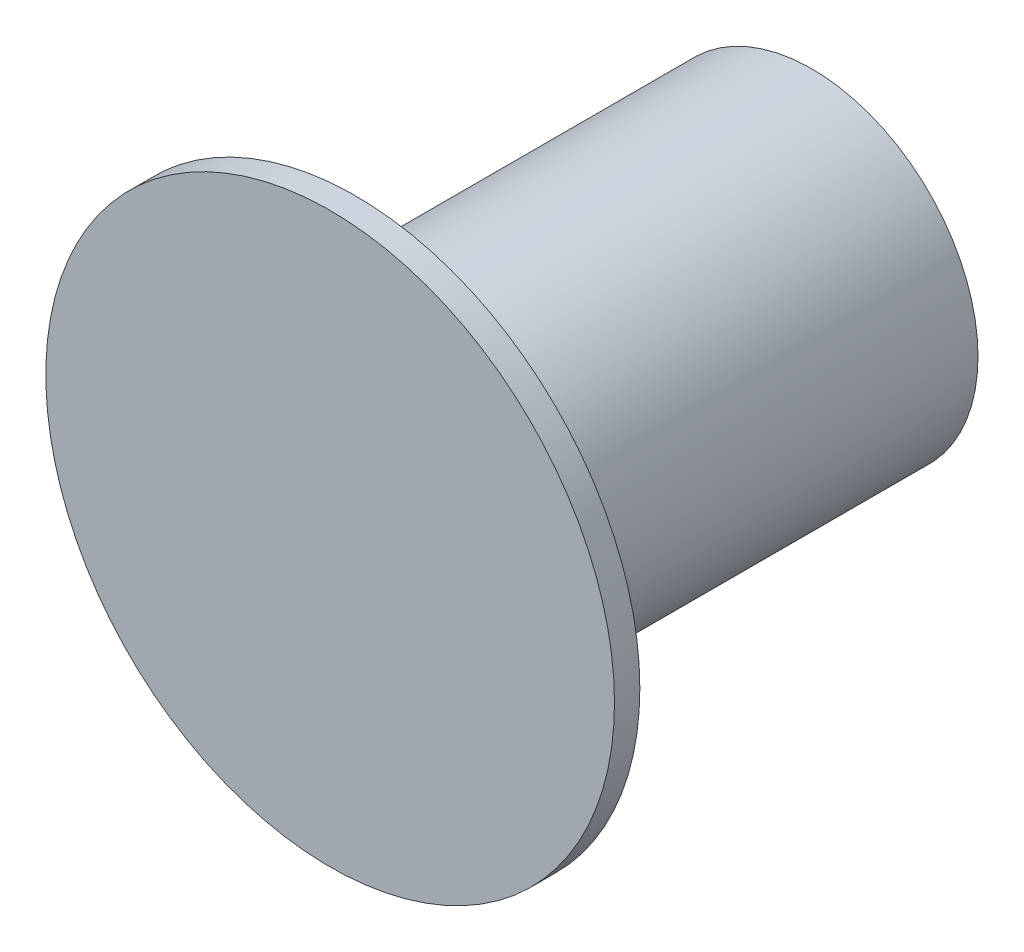
ISO-10303-21;
HEADER;
FILE_DESCRIPTION(('STEP AP214'),'2;1');
FILE_NAME('part.step','',(''),(''),'','','');
FILE_SCHEMA(('AUTOMOTIVE_DESIGN { 1 0 10303 214 1 1 1 1 }'));
ENDSEC;
DATA;
#1=APPLICATION_CONTEXT('core data for automotive mechanical design processes');
#2=APPLICATION_PROTOCOL_DEFINITION('international standard','automotive_design',2000,#1);
#3=PRODUCT_CONTEXT('',#1,'mechanical');
#4=PRODUCT('Part','Part','',(#3));
#5=PRODUCT_RELATED_PRODUCT_CATEGORY('part','',(#4));
#6=PRODUCT_DEFINITION_FORMATION('','',#4);
#7=PRODUCT_DEFINITION_CONTEXT('part definition',#1,'design');
#8=PRODUCT_DEFINITION('design','',#6,#7);
#9=PRODUCT_DEFINITION_SHAPE('','',#8);
#10=(LENGTH_UNIT() NAMED_UNIT(*) SI_UNIT(.MILLI.,.METRE.));
#11=(NAMED_UNIT(*) PLANE_ANGLE_UNIT() SI_UNIT($,.RADIAN.));
#12=(NAMED_UNIT(*) SI_UNIT($,.STERADIAN.) SOLID_ANGLE_UNIT());
#13=UNCERTAINTY_MEASURE_WITH_UNIT(LENGTH_MEASURE(1.E-05),#10,'distance_accuracy_value','');
#14=(GEOMETRIC_REPRESENTATION_CONTEXT(3) GLOBAL_UNCERTAINTY_ASSIGNED_CONTEXT((#13)) GLOBAL_UNIT_ASSIGNED_CONTEXT((#10,
#11,#12)) REPRESENTATION_CONTEXT('',''));
#15=CARTESIAN_POINT('',(0.,0.,0.));
#16=DIRECTION('',(0.,0.,1.));
#17=DIRECTION('',(1.,0.,0.));
#18=AXIS2_PLACEMENT_3D('',#15,#16,#17);
#19=CARTESIAN_POINT('',(-12.3823397391834,-201.48071253208,-28.0000000000053));
#20=DIRECTION('',(0.,0.,1.));
#21=DIRECTION('',(1.,0.,0.));
#22=AXIS2_PLACEMENT_3D('',#19,#20,#21);
#23=CYLINDRICAL_SURFACE('',#22,6.54966241096472);
#24=CARTESIAN_POINT('',(-12.3823397391834,-201.48071253208,-28.0000000000053));
#25=DIRECTION('',(0.,0.,1.));
#26=DIRECTION('',(1.,0.,0.));
#27=AXIS2_PLACEMENT_3D('',#24,#25,#26);
#28=CIRCLE('',#27,6.54966241096472);
#29=CARTESIAN_POINT('',(-5.83267732821872,-201.48071253208,-28.0000000000053));
#30=VERTEX_POINT('',#29);
#31=EDGE_CURVE('E10',#30,#30,#28,.T.);
#32=ORIENTED_EDGE('',*,*,#31,.T.);
#33=EDGE_LOOP('',(#32));
#34=FACE_BOUND('',#33,.T.);
#35=CARTESIAN_POINT('',(-12.3823397391834,-201.48071253208,-10.0000000000053));
#36=DIRECTION('',(0.,0.,1.));
#37=DIRECTION('',(1.,0.,0.));
#38=AXIS2_PLACEMENT_3D('',#35,#36,#37);
#39=CIRCLE('',#38,6.54966241096472);
#40=CARTESIAN_POINT('',(-5.83267732821872,-201.48071253208,-10.0000000000053));
#41=VERTEX_POINT('',#40);
#42=EDGE_CURVE('E42',#41,#41,#39,.T.);
#43=ORIENTED_EDGE('',*,*,#42,.F.);
#44=EDGE_LOOP('',(#43));
#45=FACE_BOUND('',#44,.T.);
#46=ADVANCED_FACE('F39',(#34,#45),#23,.T.);
#47=CARTESIAN_POINT('',(-12.3823397391834,-201.48071253208,-28.0000000000053));
#48=DIRECTION('',(0.,0.,1.));
#49=DIRECTION('',(1.,0.,0.));
#50=AXIS2_PLACEMENT_3D('',#47,#48,#49);
#51=PLANE('',#50);
#52=ORIENTED_EDGE('',*,*,#31,.F.);
#53=EDGE_LOOP('',(#52));
#54=FACE_BOUND('',#53,.T.);
#55=ADVANCED_FACE('F62',(#54),#51,.F.);
#56=CARTESIAN_POINT('',(-12.3823397391834,-201.48071253208,-9.00000000000532));
#57=DIRECTION('',(0.,0.,-1.));
#58=DIRECTION('',(-1.,0.,0.));
#59=AXIS2_PLACEMENT_3D('',#56,#57,#58);
#60=CYLINDRICAL_SURFACE('',#59,11.2137744278508);
#61=CARTESIAN_POINT('',(-12.3823397391834,-201.48071253208,-9.00000000000532));
#62=DIRECTION('',(0.,0.,1.));
#63=DIRECTION('',(1.,0.,0.));
#64=AXIS2_PLACEMENT_3D('',#61,#62,#63);
#65=CIRCLE('',#64,11.2137744278508);
#66=CARTESIAN_POINT('',(-1.16856531133259,-201.48071253208,-9.00000000000532));
#67=VERTEX_POINT('',#66);
#68=EDGE_CURVE('E49',#67,#67,#65,.T.);
#69=ORIENTED_EDGE('',*,*,#68,.F.);
#70=EDGE_LOOP('',(#69));
#71=FACE_BOUND('',#70,.T.);
#72=CARTESIAN_POINT('',(-12.3823397391834,-201.48071253208,-10.0000000000053));
#73=DIRECTION('',(0.,0.,1.));
#74=DIRECTION('',(1.,0.,0.));
#75=AXIS2_PLACEMENT_3D('',#72,#73,#74);
#76=CIRCLE('',#75,11.2137744278508);
#77=CARTESIAN_POINT('',(-1.16856531133259,-201.48071253208,-10.0000000000053));
#78=VERTEX_POINT('',#77);
#79=EDGE_CURVE('E51',#78,#78,#76,.T.);
#80=ORIENTED_EDGE('',*,*,#79,.T.);
#81=EDGE_LOOP('',(#80));
#82=FACE_BOUND('',#81,.T.);
#83=ADVANCED_FACE('F59',(#71,#82),#60,.T.);
#84=CARTESIAN_POINT('',(-12.3823397391834,-201.48071253208,-9.00000000000532));
#85=DIRECTION('',(0.,0.,1.));
#86=DIRECTION('',(1.,0.,0.));
#87=AXIS2_PLACEMENT_3D('',#84,#85,#86);
#88=PLANE('',#87);
#89=ORIENTED_EDGE('',*,*,#68,.T.);
#90=EDGE_LOOP('',(#89));
#91=FACE_BOUND('',#90,.T.);
#92=ADVANCED_FACE('F57',(#91),#88,.T.);
#93=CARTESIAN_POINT('',(-12.3823397391834,-201.48071253208,-10.0000000000053));
#94=DIRECTION('',(0.,0.,1.));
#95=DIRECTION('',(1.,0.,0.));
#96=AXIS2_PLACEMENT_3D('',#93,#94,#95);
#97=PLANE('',#96);
#98=ORIENTED_EDGE('',*,*,#42,.T.);
#99=EDGE_LOOP('',(#98));
#100=FACE_BOUND('',#99,.T.);
#101=ORIENTED_EDGE('',*,*,#79,.F.);
#102=EDGE_LOOP('',(#101));
#103=FACE_BOUND('',#102,.T.);
#104=ADVANCED_FACE('F66',(#100,#103),#97,.F.);
#105=CLOSED_SHELL('',(#46,#55,#83,#92,#104));
#106=MANIFOLD_SOLID_BREP('B2',#105);
#107=ADVANCED_BREP_SHAPE_REPRESENTATION('',(#18,#106),#14);
#108=SHAPE_DEFINITION_REPRESENTATION(#9,#107);
ENDSEC;
END-ISO-10303-21;
